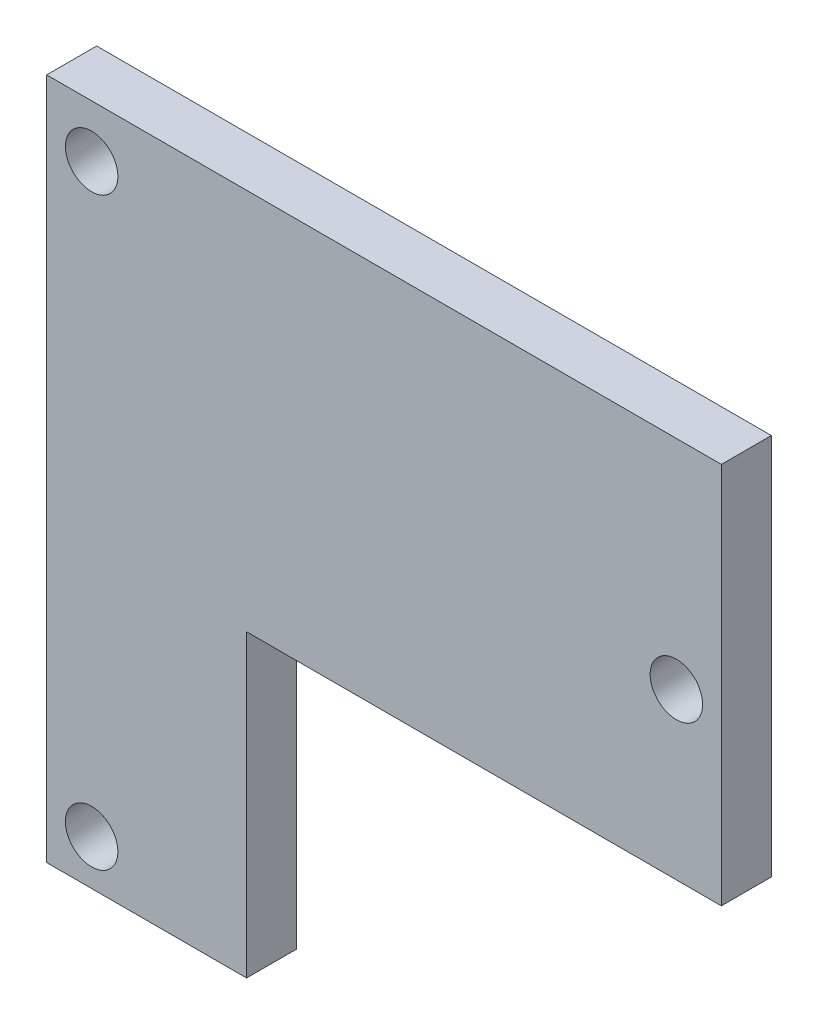
ISO-10303-21;
HEADER;
FILE_DESCRIPTION(('STEP AP214'),'2;1');
FILE_NAME('part.step','',(''),(''),'','','');
FILE_SCHEMA(('AUTOMOTIVE_DESIGN { 1 0 10303 214 1 1 1 1 }'));
ENDSEC;
DATA;
#1=APPLICATION_CONTEXT('core data for automotive mechanical design processes');
#2=APPLICATION_PROTOCOL_DEFINITION('international standard','automotive_design',2000,#1);
#3=PRODUCT_CONTEXT('',#1,'mechanical');
#4=PRODUCT('Part','Part','',(#3));
#5=PRODUCT_RELATED_PRODUCT_CATEGORY('part','',(#4));
#6=PRODUCT_DEFINITION_FORMATION('','',#4);
#7=PRODUCT_DEFINITION_CONTEXT('part definition',#1,'design');
#8=PRODUCT_DEFINITION('design','',#6,#7);
#9=PRODUCT_DEFINITION_SHAPE('','',#8);
#10=(LENGTH_UNIT() NAMED_UNIT(*) SI_UNIT(.MILLI.,.METRE.));
#11=(NAMED_UNIT(*) PLANE_ANGLE_UNIT() SI_UNIT($,.RADIAN.));
#12=(NAMED_UNIT(*) SI_UNIT($,.STERADIAN.) SOLID_ANGLE_UNIT());
#13=UNCERTAINTY_MEASURE_WITH_UNIT(LENGTH_MEASURE(1.E-05),#10,'distance_accuracy_value','');
#14=(GEOMETRIC_REPRESENTATION_CONTEXT(3) GLOBAL_UNCERTAINTY_ASSIGNED_CONTEXT((#13)) GLOBAL_UNIT_ASSIGNED_CONTEXT((#10,
#11,#12)) REPRESENTATION_CONTEXT('',''));
#15=CARTESIAN_POINT('',(0.,0.,0.));
#16=DIRECTION('',(0.,0.,1.));
#17=DIRECTION('',(1.,0.,0.));
#18=AXIS2_PLACEMENT_3D('',#15,#16,#17);
#19=CARTESIAN_POINT('',(0.,0.,2.));
#20=DIRECTION('',(0.,0.,-1.));
#21=DIRECTION('',(-1.,0.,0.));
#22=AXIS2_PLACEMENT_3D('',#19,#20,#21);
#23=PLANE('',#22);
#24=DIRECTION('',(0.,-1.,0.));
#25=VECTOR('',#24,1.);
#26=CARTESIAN_POINT('',(-53.65,-57.3,2.));
#27=LINE('',#26,#25);
#28=CARTESIAN_POINT('',(-53.65,-30.,2.));
#29=VERTEX_POINT('',#28);
#30=CARTESIAN_POINT('',(-53.65,-57.3,2.));
#31=VERTEX_POINT('',#30);
#32=EDGE_CURVE('E133',#29,#31,#27,.T.);
#33=ORIENTED_EDGE('',*,*,#32,.T.);
#34=DIRECTION('',(1.,0.,0.));
#35=VECTOR('',#34,1.);
#36=CARTESIAN_POINT('',(-53.65,-57.3,2.));
#37=LINE('',#36,#35);
#38=CARTESIAN_POINT('',(-45.65,-57.3,2.));
#39=VERTEX_POINT('',#38);
#40=EDGE_CURVE('E91',#31,#39,#37,.T.);
#41=ORIENTED_EDGE('',*,*,#40,.T.);
#42=DIRECTION('',(0.,1.,0.));
#43=VECTOR('',#42,1.);
#44=CARTESIAN_POINT('',(-45.65,-57.3,2.));
#45=LINE('',#44,#43);
#46=CARTESIAN_POINT('',(-45.65,-45.3,2.));
#47=VERTEX_POINT('',#46);
#48=EDGE_CURVE('E104',#39,#47,#45,.T.);
#49=ORIENTED_EDGE('',*,*,#48,.T.);
#50=DIRECTION('',(1.,0.,0.));
#51=VECTOR('',#50,1.);
#52=CARTESIAN_POINT('',(-45.65,-45.3,2.));
#53=LINE('',#52,#51);
#54=CARTESIAN_POINT('',(-26.65,-45.3,2.));
#55=VERTEX_POINT('',#54);
#56=EDGE_CURVE('E98',#47,#55,#53,.T.);
#57=ORIENTED_EDGE('',*,*,#56,.T.);
#58=DIRECTION('',(0.,1.,0.));
#59=VECTOR('',#58,1.);
#60=CARTESIAN_POINT('',(-26.65,-45.3,2.));
#61=LINE('',#60,#59);
#62=CARTESIAN_POINT('',(-26.65,-30.,2.));
#63=VERTEX_POINT('',#62);
#64=EDGE_CURVE('E102',#55,#63,#61,.T.);
#65=ORIENTED_EDGE('',*,*,#64,.T.);
#66=DIRECTION('',(-1.,0.,0.));
#67=VECTOR('',#66,1.);
#68=CARTESIAN_POINT('',(-53.65,-30.,2.));
#69=LINE('',#68,#67);
#70=EDGE_CURVE('E54',#63,#29,#69,.T.);
#71=ORIENTED_EDGE('',*,*,#70,.T.);
#72=EDGE_LOOP('',(#33,#41,#49,#57,#65,#71));
#73=FACE_BOUND('',#72,.T.);
#74=CARTESIAN_POINT('',(-28.45,-38.7,2.));
#75=DIRECTION('',(0.,0.,1.));
#76=DIRECTION('',(1.,0.,0.));
#77=AXIS2_PLACEMENT_3D('',#74,#75,#76);
#78=CIRCLE('',#77,1.05);
#79=CARTESIAN_POINT('',(-27.4,-38.7,2.));
#80=VERTEX_POINT('',#79);
#81=EDGE_CURVE('E126',#80,#80,#78,.T.);
#82=ORIENTED_EDGE('',*,*,#81,.F.);
#83=EDGE_LOOP('',(#82));
#84=FACE_BOUND('',#83,.T.);
#85=CARTESIAN_POINT('',(-51.85,-32.1,2.));
#86=DIRECTION('',(0.,0.,1.));
#87=DIRECTION('',(1.,0.,0.));
#88=AXIS2_PLACEMENT_3D('',#85,#86,#87);
#89=CIRCLE('',#88,1.05);
#90=CARTESIAN_POINT('',(-50.8,-32.1,2.));
#91=VERTEX_POINT('',#90);
#92=EDGE_CURVE('E187',#91,#91,#89,.T.);
#93=ORIENTED_EDGE('',*,*,#92,.F.);
#94=EDGE_LOOP('',(#93));
#95=FACE_BOUND('',#94,.T.);
#96=CARTESIAN_POINT('',(-51.85,-55.5,2.));
#97=DIRECTION('',(0.,0.,1.));
#98=DIRECTION('',(1.,0.,0.));
#99=AXIS2_PLACEMENT_3D('',#96,#97,#98);
#100=CIRCLE('',#99,1.05);
#101=CARTESIAN_POINT('',(-50.8,-55.5,2.));
#102=VERTEX_POINT('',#101);
#103=EDGE_CURVE('E178',#102,#102,#100,.T.);
#104=ORIENTED_EDGE('',*,*,#103,.F.);
#105=EDGE_LOOP('',(#104));
#106=FACE_BOUND('',#105,.T.);
#107=ADVANCED_FACE('F37',(#73,#84,#95,#106),#23,.F.);
#108=CARTESIAN_POINT('',(0.,0.,0.));
#109=DIRECTION('',(0.,0.,-1.));
#110=DIRECTION('',(-1.,0.,0.));
#111=AXIS2_PLACEMENT_3D('',#108,#109,#110);
#112=PLANE('',#111);
#113=CARTESIAN_POINT('',(-51.85,-32.1,0.));
#114=DIRECTION('',(0.,0.,1.));
#115=DIRECTION('',(1.,0.,0.));
#116=AXIS2_PLACEMENT_3D('',#113,#114,#115);
#117=CIRCLE('',#116,1.05);
#118=CARTESIAN_POINT('',(-50.8,-32.1,0.));
#119=VERTEX_POINT('',#118);
#120=EDGE_CURVE('E184',#119,#119,#117,.T.);
#121=ORIENTED_EDGE('',*,*,#120,.T.);
#122=EDGE_LOOP('',(#121));
#123=FACE_BOUND('',#122,.T.);
#124=DIRECTION('',(0.,-1.,0.));
#125=VECTOR('',#124,1.);
#126=CARTESIAN_POINT('',(-53.65,-57.3,0.));
#127=LINE('',#126,#125);
#128=CARTESIAN_POINT('',(-53.65,-30.,0.));
#129=VERTEX_POINT('',#128);
#130=CARTESIAN_POINT('',(-53.65,-57.3,0.));
#131=VERTEX_POINT('',#130);
#132=EDGE_CURVE('E122',#129,#131,#127,.T.);
#133=ORIENTED_EDGE('',*,*,#132,.F.);
#134=DIRECTION('',(-1.,0.,0.));
#135=VECTOR('',#134,1.);
#136=CARTESIAN_POINT('',(-53.65,-30.,0.));
#137=LINE('',#136,#135);
#138=CARTESIAN_POINT('',(-26.65,-30.,0.));
#139=VERTEX_POINT('',#138);
#140=EDGE_CURVE('E83',#139,#129,#137,.T.);
#141=ORIENTED_EDGE('',*,*,#140,.F.);
#142=DIRECTION('',(0.,1.,0.));
#143=VECTOR('',#142,1.);
#144=CARTESIAN_POINT('',(-26.65,-45.3,0.));
#145=LINE('',#144,#143);
#146=CARTESIAN_POINT('',(-26.65,-45.3,0.));
#147=VERTEX_POINT('',#146);
#148=EDGE_CURVE('E77',#147,#139,#145,.T.);
#149=ORIENTED_EDGE('',*,*,#148,.F.);
#150=DIRECTION('',(1.,0.,0.));
#151=VECTOR('',#150,1.);
#152=CARTESIAN_POINT('',(-45.65,-45.3,0.));
#153=LINE('',#152,#151);
#154=CARTESIAN_POINT('',(-45.65,-45.3,0.));
#155=VERTEX_POINT('',#154);
#156=EDGE_CURVE('E112',#155,#147,#153,.T.);
#157=ORIENTED_EDGE('',*,*,#156,.F.);
#158=DIRECTION('',(0.,1.,0.));
#159=VECTOR('',#158,1.);
#160=CARTESIAN_POINT('',(-45.65,-57.3,0.));
#161=LINE('',#160,#159);
#162=CARTESIAN_POINT('',(-45.65,-57.3,0.));
#163=VERTEX_POINT('',#162);
#164=EDGE_CURVE('E128',#163,#155,#161,.T.);
#165=ORIENTED_EDGE('',*,*,#164,.F.);
#166=DIRECTION('',(1.,0.,0.));
#167=VECTOR('',#166,1.);
#168=CARTESIAN_POINT('',(-53.65,-57.3,0.));
#169=LINE('',#168,#167);
#170=EDGE_CURVE('E125',#131,#163,#169,.T.);
#171=ORIENTED_EDGE('',*,*,#170,.F.);
#172=EDGE_LOOP('',(#133,#141,#149,#157,#165,#171));
#173=FACE_BOUND('',#172,.T.);
#174=CARTESIAN_POINT('',(-28.45,-38.7,0.));
#175=DIRECTION('',(0.,0.,1.));
#176=DIRECTION('',(1.,0.,0.));
#177=AXIS2_PLACEMENT_3D('',#174,#175,#176);
#178=CIRCLE('',#177,1.05);
#179=CARTESIAN_POINT('',(-27.4,-38.7,0.));
#180=VERTEX_POINT('',#179);
#181=EDGE_CURVE('E190',#180,#180,#178,.T.);
#182=ORIENTED_EDGE('',*,*,#181,.T.);
#183=EDGE_LOOP('',(#182));
#184=FACE_BOUND('',#183,.T.);
#185=CARTESIAN_POINT('',(-51.85,-55.5,0.));
#186=DIRECTION('',(0.,0.,1.));
#187=DIRECTION('',(1.,0.,0.));
#188=AXIS2_PLACEMENT_3D('',#185,#186,#187);
#189=CIRCLE('',#188,1.05);
#190=CARTESIAN_POINT('',(-50.8,-55.5,0.));
#191=VERTEX_POINT('',#190);
#192=EDGE_CURVE('E181',#191,#191,#189,.T.);
#193=ORIENTED_EDGE('',*,*,#192,.T.);
#194=EDGE_LOOP('',(#193));
#195=FACE_BOUND('',#194,.T.);
#196=ADVANCED_FACE('F142',(#123,#173,#184,#195),#112,.T.);
#197=CARTESIAN_POINT('',(-53.65,-57.3,2.));
#198=DIRECTION('',(1.,0.,0.));
#199=DIRECTION('',(0.,0.,-1.));
#200=AXIS2_PLACEMENT_3D('',#197,#198,#199);
#201=PLANE('',#200);
#202=ORIENTED_EDGE('',*,*,#132,.T.);
#203=DIRECTION('',(0.,0.,-1.));
#204=VECTOR('',#203,1.);
#205=CARTESIAN_POINT('',(-53.65,-57.3,2.));
#206=LINE('',#205,#204);
#207=EDGE_CURVE('E11',#31,#131,#206,.T.);
#208=ORIENTED_EDGE('',*,*,#207,.F.);
#209=ORIENTED_EDGE('',*,*,#32,.F.);
#210=DIRECTION('',(0.,0.,-1.));
#211=VECTOR('',#210,1.);
#212=CARTESIAN_POINT('',(-53.65,-30.,2.));
#213=LINE('',#212,#211);
#214=EDGE_CURVE('E118',#29,#129,#213,.T.);
#215=ORIENTED_EDGE('',*,*,#214,.T.);
#216=EDGE_LOOP('',(#202,#208,#209,#215));
#217=FACE_BOUND('',#216,.T.);
#218=ADVANCED_FACE('F39',(#217),#201,.F.);
#219=CARTESIAN_POINT('',(-53.65,-57.3,2.));
#220=DIRECTION('',(0.,1.,0.));
#221=DIRECTION('',(0.,0.,1.));
#222=AXIS2_PLACEMENT_3D('',#219,#220,#221);
#223=PLANE('',#222);
#224=ORIENTED_EDGE('',*,*,#170,.T.);
#225=DIRECTION('',(0.,0.,-1.));
#226=VECTOR('',#225,1.);
#227=CARTESIAN_POINT('',(-45.65,-57.3,2.));
#228=LINE('',#227,#226);
#229=EDGE_CURVE('E46',#39,#163,#228,.T.);
#230=ORIENTED_EDGE('',*,*,#229,.F.);
#231=ORIENTED_EDGE('',*,*,#40,.F.);
#232=ORIENTED_EDGE('',*,*,#207,.T.);
#233=EDGE_LOOP('',(#224,#230,#231,#232));
#234=FACE_BOUND('',#233,.T.);
#235=ADVANCED_FACE('F241',(#234),#223,.F.);
#236=CARTESIAN_POINT('',(-45.65,-57.3,2.));
#237=DIRECTION('',(-1.,0.,0.));
#238=DIRECTION('',(0.,0.,1.));
#239=AXIS2_PLACEMENT_3D('',#236,#237,#238);
#240=PLANE('',#239);
#241=ORIENTED_EDGE('',*,*,#164,.T.);
#242=DIRECTION('',(0.,0.,-1.));
#243=VECTOR('',#242,1.);
#244=CARTESIAN_POINT('',(-45.65,-45.3,2.));
#245=LINE('',#244,#243);
#246=EDGE_CURVE('E113',#47,#155,#245,.T.);
#247=ORIENTED_EDGE('',*,*,#246,.F.);
#248=ORIENTED_EDGE('',*,*,#48,.F.);
#249=ORIENTED_EDGE('',*,*,#229,.T.);
#250=EDGE_LOOP('',(#241,#247,#248,#249));
#251=FACE_BOUND('',#250,.T.);
#252=ADVANCED_FACE('F139',(#251),#240,.F.);
#253=CARTESIAN_POINT('',(-45.65,-45.3,2.));
#254=DIRECTION('',(0.,1.,0.));
#255=DIRECTION('',(0.,0.,1.));
#256=AXIS2_PLACEMENT_3D('',#253,#254,#255);
#257=PLANE('',#256);
#258=ORIENTED_EDGE('',*,*,#156,.T.);
#259=DIRECTION('',(0.,0.,-1.));
#260=VECTOR('',#259,1.);
#261=CARTESIAN_POINT('',(-26.65,-45.3,2.));
#262=LINE('',#261,#260);
#263=EDGE_CURVE('E109',#55,#147,#262,.T.);
#264=ORIENTED_EDGE('',*,*,#263,.F.);
#265=ORIENTED_EDGE('',*,*,#56,.F.);
#266=ORIENTED_EDGE('',*,*,#246,.T.);
#267=EDGE_LOOP('',(#258,#264,#265,#266));
#268=FACE_BOUND('',#267,.T.);
#269=ADVANCED_FACE('F110',(#268),#257,.F.);
#270=CARTESIAN_POINT('',(-26.65,-45.3,2.));
#271=DIRECTION('',(-1.,0.,0.));
#272=DIRECTION('',(0.,0.,1.));
#273=AXIS2_PLACEMENT_3D('',#270,#271,#272);
#274=PLANE('',#273);
#275=ORIENTED_EDGE('',*,*,#148,.T.);
#276=DIRECTION('',(0.,0.,-1.));
#277=VECTOR('',#276,1.);
#278=CARTESIAN_POINT('',(-26.65,-30.,2.));
#279=LINE('',#278,#277);
#280=EDGE_CURVE('E114',#63,#139,#279,.T.);
#281=ORIENTED_EDGE('',*,*,#280,.F.);
#282=ORIENTED_EDGE('',*,*,#64,.F.);
#283=ORIENTED_EDGE('',*,*,#263,.T.);
#284=EDGE_LOOP('',(#275,#281,#282,#283));
#285=FACE_BOUND('',#284,.T.);
#286=ADVANCED_FACE('F116',(#285),#274,.F.);
#287=CARTESIAN_POINT('',(-53.65,-30.,2.));
#288=DIRECTION('',(0.,-1.,0.));
#289=DIRECTION('',(0.,0.,-1.));
#290=AXIS2_PLACEMENT_3D('',#287,#288,#289);
#291=PLANE('',#290);
#292=ORIENTED_EDGE('',*,*,#140,.T.);
#293=ORIENTED_EDGE('',*,*,#214,.F.);
#294=ORIENTED_EDGE('',*,*,#70,.F.);
#295=ORIENTED_EDGE('',*,*,#280,.T.);
#296=EDGE_LOOP('',(#292,#293,#294,#295));
#297=FACE_BOUND('',#296,.T.);
#298=ADVANCED_FACE('F147',(#297),#291,.F.);
#299=CARTESIAN_POINT('',(-28.45,-38.7,2.));
#300=DIRECTION('',(0.,0.,-1.));
#301=DIRECTION('',(-1.,0.,0.));
#302=AXIS2_PLACEMENT_3D('',#299,#300,#301);
#303=CYLINDRICAL_SURFACE('',#302,1.05);
#304=ORIENTED_EDGE('',*,*,#81,.T.);
#305=EDGE_LOOP('',(#304));
#306=FACE_BOUND('',#305,.T.);
#307=ORIENTED_EDGE('',*,*,#181,.F.);
#308=EDGE_LOOP('',(#307));
#309=FACE_BOUND('',#308,.T.);
#310=ADVANCED_FACE('F149',(#306,#309),#303,.F.);
#311=CARTESIAN_POINT('',(-51.85,-32.1,2.));
#312=DIRECTION('',(0.,0.,-1.));
#313=DIRECTION('',(-1.,0.,0.));
#314=AXIS2_PLACEMENT_3D('',#311,#312,#313);
#315=CYLINDRICAL_SURFACE('',#314,1.05);
#316=ORIENTED_EDGE('',*,*,#92,.T.);
#317=EDGE_LOOP('',(#316));
#318=FACE_BOUND('',#317,.T.);
#319=ORIENTED_EDGE('',*,*,#120,.F.);
#320=EDGE_LOOP('',(#319));
#321=FACE_BOUND('',#320,.T.);
#322=ADVANCED_FACE('F155',(#318,#321),#315,.F.);
#323=CARTESIAN_POINT('',(-51.85,-55.5,2.));
#324=DIRECTION('',(0.,0.,-1.));
#325=DIRECTION('',(-1.,0.,0.));
#326=AXIS2_PLACEMENT_3D('',#323,#324,#325);
#327=CYLINDRICAL_SURFACE('',#326,1.05);
#328=ORIENTED_EDGE('',*,*,#103,.T.);
#329=EDGE_LOOP('',(#328));
#330=FACE_BOUND('',#329,.T.);
#331=ORIENTED_EDGE('',*,*,#192,.F.);
#332=EDGE_LOOP('',(#331));
#333=FACE_BOUND('',#332,.T.);
#334=ADVANCED_FACE('F169',(#330,#333),#327,.F.);
#335=CLOSED_SHELL('',(#107,#196,#218,#235,#252,#269,#286,#298,#310,#322,#334));
#336=MANIFOLD_SOLID_BREP('B2',#335);
#337=ADVANCED_BREP_SHAPE_REPRESENTATION('',(#18,#336),#14);
#338=SHAPE_DEFINITION_REPRESENTATION(#9,#337);
ENDSEC;
END-ISO-10303-21;
